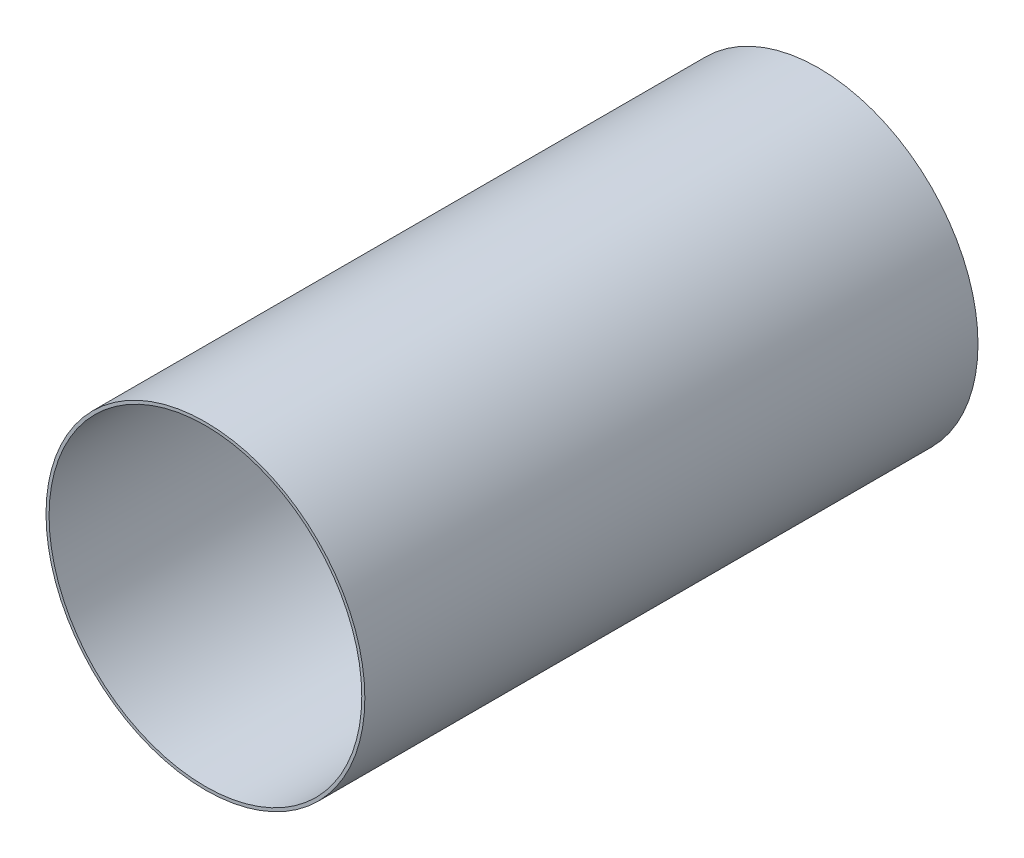
ISO-10303-21;
HEADER;
FILE_DESCRIPTION(('STEP AP214'),'2;1');
FILE_NAME('part.step','',(''),(''),'','','');
FILE_SCHEMA(('AUTOMOTIVE_DESIGN { 1 0 10303 214 1 1 1 1 }'));
ENDSEC;
DATA;
#1=APPLICATION_CONTEXT('core data for automotive mechanical design processes');
#2=APPLICATION_PROTOCOL_DEFINITION('international standard','automotive_design',2000,#1);
#3=PRODUCT_CONTEXT('',#1,'mechanical');
#4=PRODUCT('Part','Part','',(#3));
#5=PRODUCT_RELATED_PRODUCT_CATEGORY('part','',(#4));
#6=PRODUCT_DEFINITION_FORMATION('','',#4);
#7=PRODUCT_DEFINITION_CONTEXT('part definition',#1,'design');
#8=PRODUCT_DEFINITION('design','',#6,#7);
#9=PRODUCT_DEFINITION_SHAPE('','',#8);
#10=(LENGTH_UNIT() NAMED_UNIT(*) SI_UNIT(.MILLI.,.METRE.));
#11=(NAMED_UNIT(*) PLANE_ANGLE_UNIT() SI_UNIT($,.RADIAN.));
#12=(NAMED_UNIT(*) SI_UNIT($,.STERADIAN.) SOLID_ANGLE_UNIT());
#13=UNCERTAINTY_MEASURE_WITH_UNIT(LENGTH_MEASURE(1.E-05),#10,'distance_accuracy_value','');
#14=(GEOMETRIC_REPRESENTATION_CONTEXT(3) GLOBAL_UNCERTAINTY_ASSIGNED_CONTEXT((#13)) GLOBAL_UNIT_ASSIGNED_CONTEXT((#10,
#11,#12)) REPRESENTATION_CONTEXT('',''));
#15=CARTESIAN_POINT('',(0.,0.,0.));
#16=DIRECTION('',(0.,0.,1.));
#17=DIRECTION('',(1.,0.,0.));
#18=AXIS2_PLACEMENT_3D('',#15,#16,#17);
#19=CARTESIAN_POINT('',(0.,0.,10.));
#20=DIRECTION('',(0.,0.,1.));
#21=DIRECTION('',(1.,0.,0.));
#22=AXIS2_PLACEMENT_3D('',#19,#20,#21);
#23=PLANE('',#22);
#24=CARTESIAN_POINT('',(0.,0.,10.));
#25=DIRECTION('',(0.,0.,1.));
#26=DIRECTION('',(1.,0.,0.));
#27=AXIS2_PLACEMENT_3D('',#24,#25,#26);
#28=CIRCLE('',#27,2.6);
#29=CARTESIAN_POINT('',(2.6,0.,10.));
#30=VERTEX_POINT('',#29);
#31=EDGE_CURVE('E10',#30,#30,#28,.T.);
#32=ORIENTED_EDGE('',*,*,#31,.T.);
#33=EDGE_LOOP('',(#32));
#34=FACE_BOUND('',#33,.T.);
#35=CARTESIAN_POINT('',(0.,0.,10.));
#36=DIRECTION('',(0.,0.,1.));
#37=DIRECTION('',(1.,0.,0.));
#38=AXIS2_PLACEMENT_3D('',#35,#36,#37);
#39=CIRCLE('',#38,2.55);
#40=CARTESIAN_POINT('',(2.55,0.,10.));
#41=VERTEX_POINT('',#40);
#42=EDGE_CURVE('E50',#41,#41,#39,.T.);
#43=ORIENTED_EDGE('',*,*,#42,.F.);
#44=EDGE_LOOP('',(#43));
#45=FACE_BOUND('',#44,.T.);
#46=ADVANCED_FACE('F37',(#34,#45),#23,.T.);
#47=CARTESIAN_POINT('',(0.,0.,0.));
#48=DIRECTION('',(0.,0.,1.));
#49=DIRECTION('',(1.,0.,0.));
#50=AXIS2_PLACEMENT_3D('',#47,#48,#49);
#51=PLANE('',#50);
#52=CARTESIAN_POINT('',(0.,0.,0.));
#53=DIRECTION('',(0.,0.,1.));
#54=DIRECTION('',(1.,0.,0.));
#55=AXIS2_PLACEMENT_3D('',#52,#53,#54);
#56=CIRCLE('',#55,2.6);
#57=CARTESIAN_POINT('',(2.6,0.,0.));
#58=VERTEX_POINT('',#57);
#59=EDGE_CURVE('E41',#58,#58,#56,.T.);
#60=ORIENTED_EDGE('',*,*,#59,.F.);
#61=EDGE_LOOP('',(#60));
#62=FACE_BOUND('',#61,.T.);
#63=CARTESIAN_POINT('',(0.,0.,0.));
#64=DIRECTION('',(0.,0.,1.));
#65=DIRECTION('',(1.,0.,0.));
#66=AXIS2_PLACEMENT_3D('',#63,#64,#65);
#67=CIRCLE('',#66,2.55);
#68=CARTESIAN_POINT('',(2.55,0.,0.));
#69=VERTEX_POINT('',#68);
#70=EDGE_CURVE('E52',#69,#69,#67,.T.);
#71=ORIENTED_EDGE('',*,*,#70,.T.);
#72=EDGE_LOOP('',(#71));
#73=FACE_BOUND('',#72,.T.);
#74=ADVANCED_FACE('F64',(#62,#73),#51,.F.);
#75=CARTESIAN_POINT('',(0.,0.,10.));
#76=DIRECTION('',(0.,0.,-1.));
#77=DIRECTION('',(-1.,0.,0.));
#78=AXIS2_PLACEMENT_3D('',#75,#76,#77);
#79=CYLINDRICAL_SURFACE('',#78,2.6);
#80=ORIENTED_EDGE('',*,*,#31,.F.);
#81=EDGE_LOOP('',(#80));
#82=FACE_BOUND('',#81,.T.);
#83=ORIENTED_EDGE('',*,*,#59,.T.);
#84=EDGE_LOOP('',(#83));
#85=FACE_BOUND('',#84,.T.);
#86=ADVANCED_FACE('F39',(#82,#85),#79,.T.);
#87=CARTESIAN_POINT('',(0.,0.,10.));
#88=DIRECTION('',(0.,0.,-1.));
#89=DIRECTION('',(-1.,0.,0.));
#90=AXIS2_PLACEMENT_3D('',#87,#88,#89);
#91=CYLINDRICAL_SURFACE('',#90,2.55);
#92=ORIENTED_EDGE('',*,*,#42,.T.);
#93=EDGE_LOOP('',(#92));
#94=FACE_BOUND('',#93,.T.);
#95=ORIENTED_EDGE('',*,*,#70,.F.);
#96=EDGE_LOOP('',(#95));
#97=FACE_BOUND('',#96,.T.);
#98=ADVANCED_FACE('F60',(#94,#97),#91,.F.);
#99=CLOSED_SHELL('',(#46,#74,#86,#98));
#100=MANIFOLD_SOLID_BREP('B2',#99);
#101=ADVANCED_BREP_SHAPE_REPRESENTATION('',(#18,#100),#14);
#102=SHAPE_DEFINITION_REPRESENTATION(#9,#101);
ENDSEC;
END-ISO-10303-21;
